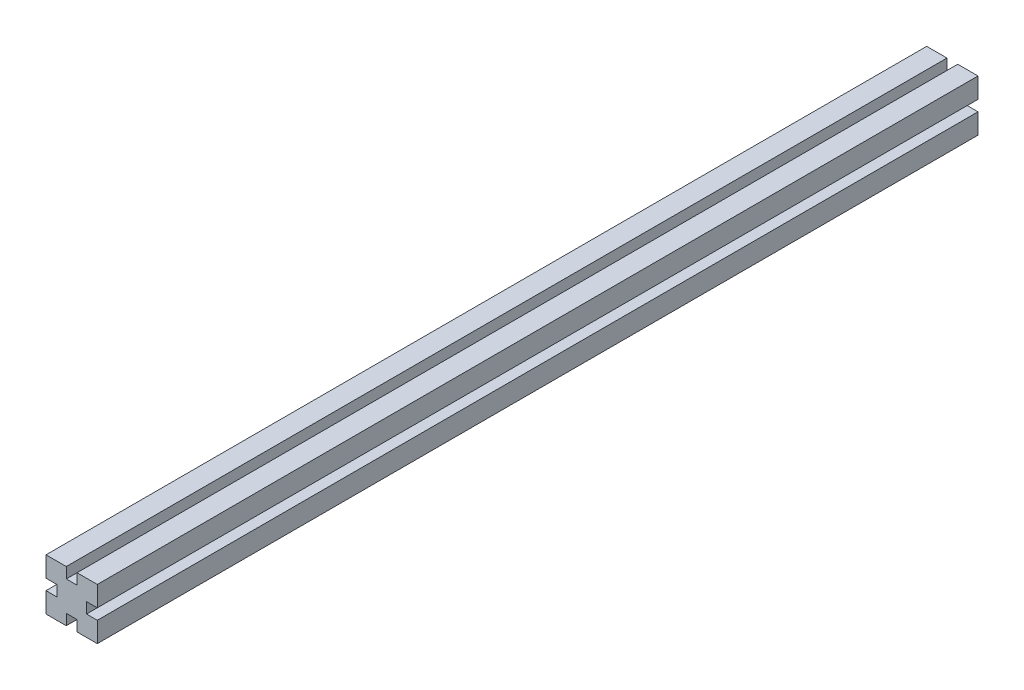
ISO-10303-21;
HEADER;
FILE_DESCRIPTION(('STEP AP214'),'2;1');
FILE_NAME('part.step','',(''),(''),'','','');
FILE_SCHEMA(('AUTOMOTIVE_DESIGN { 1 0 10303 214 1 1 1 1 }'));
ENDSEC;
DATA;
#1=APPLICATION_CONTEXT('core data for automotive mechanical design processes');
#2=APPLICATION_PROTOCOL_DEFINITION('international standard','automotive_design',2000,#1);
#3=PRODUCT_CONTEXT('',#1,'mechanical');
#4=PRODUCT('Part','Part','',(#3));
#5=PRODUCT_RELATED_PRODUCT_CATEGORY('part','',(#4));
#6=PRODUCT_DEFINITION_FORMATION('','',#4);
#7=PRODUCT_DEFINITION_CONTEXT('part definition',#1,'design');
#8=PRODUCT_DEFINITION('design','',#6,#7);
#9=PRODUCT_DEFINITION_SHAPE('','',#8);
#10=(LENGTH_UNIT() NAMED_UNIT(*) SI_UNIT(.MILLI.,.METRE.));
#11=(NAMED_UNIT(*) PLANE_ANGLE_UNIT() SI_UNIT($,.RADIAN.));
#12=(NAMED_UNIT(*) SI_UNIT($,.STERADIAN.) SOLID_ANGLE_UNIT());
#13=UNCERTAINTY_MEASURE_WITH_UNIT(LENGTH_MEASURE(1.E-05),#10,'distance_accuracy_value','');
#14=(GEOMETRIC_REPRESENTATION_CONTEXT(3) GLOBAL_UNCERTAINTY_ASSIGNED_CONTEXT((#13)) GLOBAL_UNIT_ASSIGNED_CONTEXT((#10,
#11,#12)) REPRESENTATION_CONTEXT('',''));
#15=CARTESIAN_POINT('',(0.,0.,0.));
#16=DIRECTION('',(0.,0.,1.));
#17=DIRECTION('',(1.,0.,0.));
#18=AXIS2_PLACEMENT_3D('',#15,#16,#17);
#19=CARTESIAN_POINT('',(-19.05,-4.,654.05));
#20=DIRECTION('',(1.,0.,0.));
#21=DIRECTION('',(0.,0.,-1.));
#22=AXIS2_PLACEMENT_3D('',#19,#20,#21);
#23=PLANE('',#22);
#24=DIRECTION('',(0.,-1.,0.));
#25=VECTOR('',#24,1.);
#26=CARTESIAN_POINT('',(-19.05,-4.,0.));
#27=LINE('',#26,#25);
#28=CARTESIAN_POINT('',(-19.05,-4.,0.));
#29=VERTEX_POINT('',#28);
#30=CARTESIAN_POINT('',(-19.05,-19.05,0.));
#31=VERTEX_POINT('',#30);
#32=EDGE_CURVE('E207',#29,#31,#27,.T.);
#33=ORIENTED_EDGE('',*,*,#32,.T.);
#34=DIRECTION('',(0.,0.,-1.));
#35=VECTOR('',#34,1.);
#36=CARTESIAN_POINT('',(-19.05,-19.05,654.05));
#37=LINE('',#36,#35);
#38=CARTESIAN_POINT('',(-19.05,-19.05,654.05));
#39=VERTEX_POINT('',#38);
#40=EDGE_CURVE('E11',#39,#31,#37,.T.);
#41=ORIENTED_EDGE('',*,*,#40,.F.);
#42=DIRECTION('',(0.,-1.,0.));
#43=VECTOR('',#42,1.);
#44=CARTESIAN_POINT('',(-19.05,-4.,654.05));
#45=LINE('',#44,#43);
#46=CARTESIAN_POINT('',(-19.05,-4.,654.05));
#47=VERTEX_POINT('',#46);
#48=EDGE_CURVE('E245',#47,#39,#45,.T.);
#49=ORIENTED_EDGE('',*,*,#48,.F.);
#50=DIRECTION('',(0.,0.,-1.));
#51=VECTOR('',#50,1.);
#52=CARTESIAN_POINT('',(-19.05,-4.,654.05));
#53=LINE('',#52,#51);
#54=EDGE_CURVE('E203',#47,#29,#53,.T.);
#55=ORIENTED_EDGE('',*,*,#54,.T.);
#56=EDGE_LOOP('',(#33,#41,#49,#55));
#57=FACE_BOUND('',#56,.T.);
#58=ADVANCED_FACE('F39',(#57),#23,.F.);
#59=CARTESIAN_POINT('',(-19.05,-19.05,654.05));
#60=DIRECTION('',(0.,1.,0.));
#61=DIRECTION('',(0.,0.,1.));
#62=AXIS2_PLACEMENT_3D('',#59,#60,#61);
#63=PLANE('',#62);
#64=DIRECTION('',(1.,0.,0.));
#65=VECTOR('',#64,1.);
#66=CARTESIAN_POINT('',(-19.05,-19.05,0.));
#67=LINE('',#66,#65);
#68=CARTESIAN_POINT('',(-4.,-19.05,0.));
#69=VERTEX_POINT('',#68);
#70=EDGE_CURVE('E210',#31,#69,#67,.T.);
#71=ORIENTED_EDGE('',*,*,#70,.T.);
#72=DIRECTION('',(0.,0.,-1.));
#73=VECTOR('',#72,1.);
#74=CARTESIAN_POINT('',(-4.,-19.05,654.05));
#75=LINE('',#74,#73);
#76=CARTESIAN_POINT('',(-4.,-19.05,654.05));
#77=VERTEX_POINT('',#76);
#78=EDGE_CURVE('E47',#77,#69,#75,.T.);
#79=ORIENTED_EDGE('',*,*,#78,.F.);
#80=DIRECTION('',(1.,0.,0.));
#81=VECTOR('',#80,1.);
#82=CARTESIAN_POINT('',(-19.05,-19.05,654.05));
#83=LINE('',#82,#81);
#84=EDGE_CURVE('E134',#39,#77,#83,.T.);
#85=ORIENTED_EDGE('',*,*,#84,.F.);
#86=ORIENTED_EDGE('',*,*,#40,.T.);
#87=EDGE_LOOP('',(#71,#79,#85,#86));
#88=FACE_BOUND('',#87,.T.);
#89=ADVANCED_FACE('F363',(#88),#63,.F.);
#90=CARTESIAN_POINT('',(-4.,-19.05,654.05));
#91=DIRECTION('',(-1.,0.,0.));
#92=DIRECTION('',(0.,0.,1.));
#93=AXIS2_PLACEMENT_3D('',#90,#91,#92);
#94=PLANE('',#93);
#95=DIRECTION('',(0.,1.,0.));
#96=VECTOR('',#95,1.);
#97=CARTESIAN_POINT('',(-4.,-19.05,0.));
#98=LINE('',#97,#96);
#99=CARTESIAN_POINT('',(-4.,-11.05,0.));
#100=VERTEX_POINT('',#99);
#101=EDGE_CURVE('E212',#69,#100,#98,.T.);
#102=ORIENTED_EDGE('',*,*,#101,.T.);
#103=DIRECTION('',(0.,0.,-1.));
#104=VECTOR('',#103,1.);
#105=CARTESIAN_POINT('',(-4.,-11.05,654.05));
#106=LINE('',#105,#104);
#107=CARTESIAN_POINT('',(-4.,-11.05,654.05));
#108=VERTEX_POINT('',#107);
#109=EDGE_CURVE('E288',#108,#100,#106,.T.);
#110=ORIENTED_EDGE('',*,*,#109,.F.);
#111=DIRECTION('',(0.,1.,0.));
#112=VECTOR('',#111,1.);
#113=CARTESIAN_POINT('',(-4.,-19.05,654.05));
#114=LINE('',#113,#112);
#115=EDGE_CURVE('E296',#77,#108,#114,.T.);
#116=ORIENTED_EDGE('',*,*,#115,.F.);
#117=ORIENTED_EDGE('',*,*,#78,.T.);
#118=EDGE_LOOP('',(#102,#110,#116,#117));
#119=FACE_BOUND('',#118,.T.);
#120=ADVANCED_FACE('F294',(#119),#94,.F.);
#121=CARTESIAN_POINT('',(-4.,-11.05,654.05));
#122=DIRECTION('',(0.,1.,0.));
#123=DIRECTION('',(0.,0.,1.));
#124=AXIS2_PLACEMENT_3D('',#121,#122,#123);
#125=PLANE('',#124);
#126=DIRECTION('',(1.,0.,0.));
#127=VECTOR('',#126,1.);
#128=CARTESIAN_POINT('',(-4.,-11.05,0.));
#129=LINE('',#128,#127);
#130=CARTESIAN_POINT('',(4.,-11.05,0.));
#131=VERTEX_POINT('',#130);
#132=EDGE_CURVE('E214',#100,#131,#129,.T.);
#133=ORIENTED_EDGE('',*,*,#132,.T.);
#134=DIRECTION('',(0.,0.,-1.));
#135=VECTOR('',#134,1.);
#136=CARTESIAN_POINT('',(4.,-11.05,654.05));
#137=LINE('',#136,#135);
#138=CARTESIAN_POINT('',(4.,-11.05,654.05));
#139=VERTEX_POINT('',#138);
#140=EDGE_CURVE('E285',#139,#131,#137,.T.);
#141=ORIENTED_EDGE('',*,*,#140,.F.);
#142=DIRECTION('',(1.,0.,0.));
#143=VECTOR('',#142,1.);
#144=CARTESIAN_POINT('',(-4.,-11.05,654.05));
#145=LINE('',#144,#143);
#146=EDGE_CURVE('E314',#108,#139,#145,.T.);
#147=ORIENTED_EDGE('',*,*,#146,.F.);
#148=ORIENTED_EDGE('',*,*,#109,.T.);
#149=EDGE_LOOP('',(#133,#141,#147,#148));
#150=FACE_BOUND('',#149,.T.);
#151=ADVANCED_FACE('F305',(#150),#125,.F.);
#152=CARTESIAN_POINT('',(4.,-11.05,654.05));
#153=DIRECTION('',(1.,0.,0.));
#154=DIRECTION('',(0.,0.,-1.));
#155=AXIS2_PLACEMENT_3D('',#152,#153,#154);
#156=PLANE('',#155);
#157=DIRECTION('',(0.,-1.,0.));
#158=VECTOR('',#157,1.);
#159=CARTESIAN_POINT('',(4.,-11.05,0.));
#160=LINE('',#159,#158);
#161=CARTESIAN_POINT('',(4.,-19.05,0.));
#162=VERTEX_POINT('',#161);
#163=EDGE_CURVE('E216',#131,#162,#160,.T.);
#164=ORIENTED_EDGE('',*,*,#163,.T.);
#165=DIRECTION('',(0.,0.,-1.));
#166=VECTOR('',#165,1.);
#167=CARTESIAN_POINT('',(4.,-19.05,654.05));
#168=LINE('',#167,#166);
#169=CARTESIAN_POINT('',(4.,-19.05,654.05));
#170=VERTEX_POINT('',#169);
#171=EDGE_CURVE('E282',#170,#162,#168,.T.);
#172=ORIENTED_EDGE('',*,*,#171,.F.);
#173=DIRECTION('',(0.,-1.,0.));
#174=VECTOR('',#173,1.);
#175=CARTESIAN_POINT('',(4.,-11.05,654.05));
#176=LINE('',#175,#174);
#177=EDGE_CURVE('E311',#139,#170,#176,.T.);
#178=ORIENTED_EDGE('',*,*,#177,.F.);
#179=ORIENTED_EDGE('',*,*,#140,.T.);
#180=EDGE_LOOP('',(#164,#172,#178,#179));
#181=FACE_BOUND('',#180,.T.);
#182=ADVANCED_FACE('F309',(#181),#156,.F.);
#183=CARTESIAN_POINT('',(4.,-19.05,654.05));
#184=DIRECTION('',(0.,1.,0.));
#185=DIRECTION('',(0.,0.,1.));
#186=AXIS2_PLACEMENT_3D('',#183,#184,#185);
#187=PLANE('',#186);
#188=DIRECTION('',(1.,0.,0.));
#189=VECTOR('',#188,1.);
#190=CARTESIAN_POINT('',(4.,-19.05,0.));
#191=LINE('',#190,#189);
#192=CARTESIAN_POINT('',(19.05,-19.05,0.));
#193=VERTEX_POINT('',#192);
#194=EDGE_CURVE('E218',#162,#193,#191,.T.);
#195=ORIENTED_EDGE('',*,*,#194,.T.);
#196=DIRECTION('',(0.,0.,-1.));
#197=VECTOR('',#196,1.);
#198=CARTESIAN_POINT('',(19.05,-19.05,654.05));
#199=LINE('',#198,#197);
#200=CARTESIAN_POINT('',(19.05,-19.05,654.05));
#201=VERTEX_POINT('',#200);
#202=EDGE_CURVE('E279',#201,#193,#199,.T.);
#203=ORIENTED_EDGE('',*,*,#202,.F.);
#204=DIRECTION('',(1.,0.,0.));
#205=VECTOR('',#204,1.);
#206=CARTESIAN_POINT('',(4.,-19.05,654.05));
#207=LINE('',#206,#205);
#208=EDGE_CURVE('E313',#170,#201,#207,.T.);
#209=ORIENTED_EDGE('',*,*,#208,.F.);
#210=ORIENTED_EDGE('',*,*,#171,.T.);
#211=EDGE_LOOP('',(#195,#203,#209,#210));
#212=FACE_BOUND('',#211,.T.);
#213=ADVANCED_FACE('F376',(#212),#187,.F.);
#214=CARTESIAN_POINT('',(19.05,-19.05,654.05));
#215=DIRECTION('',(-1.,0.,0.));
#216=DIRECTION('',(0.,0.,1.));
#217=AXIS2_PLACEMENT_3D('',#214,#215,#216);
#218=PLANE('',#217);
#219=DIRECTION('',(0.,1.,0.));
#220=VECTOR('',#219,1.);
#221=CARTESIAN_POINT('',(19.05,-19.05,0.));
#222=LINE('',#221,#220);
#223=CARTESIAN_POINT('',(19.05,-4.,0.));
#224=VERTEX_POINT('',#223);
#225=EDGE_CURVE('E220',#193,#224,#222,.T.);
#226=ORIENTED_EDGE('',*,*,#225,.T.);
#227=DIRECTION('',(0.,0.,-1.));
#228=VECTOR('',#227,1.);
#229=CARTESIAN_POINT('',(19.05,-4.,654.05));
#230=LINE('',#229,#228);
#231=CARTESIAN_POINT('',(19.05,-4.,654.05));
#232=VERTEX_POINT('',#231);
#233=EDGE_CURVE('E276',#232,#224,#230,.T.);
#234=ORIENTED_EDGE('',*,*,#233,.F.);
#235=DIRECTION('',(0.,1.,0.));
#236=VECTOR('',#235,1.);
#237=CARTESIAN_POINT('',(19.05,-19.05,654.05));
#238=LINE('',#237,#236);
#239=EDGE_CURVE('E316',#201,#232,#238,.T.);
#240=ORIENTED_EDGE('',*,*,#239,.F.);
#241=ORIENTED_EDGE('',*,*,#202,.T.);
#242=EDGE_LOOP('',(#226,#234,#240,#241));
#243=FACE_BOUND('',#242,.T.);
#244=ADVANCED_FACE('F379',(#243),#218,.F.);
#245=CARTESIAN_POINT('',(19.05,-4.,654.05));
#246=DIRECTION('',(0.,-1.,0.));
#247=DIRECTION('',(0.,0.,-1.));
#248=AXIS2_PLACEMENT_3D('',#245,#246,#247);
#249=PLANE('',#248);
#250=DIRECTION('',(-1.,0.,0.));
#251=VECTOR('',#250,1.);
#252=CARTESIAN_POINT('',(19.05,-4.,0.));
#253=LINE('',#252,#251);
#254=CARTESIAN_POINT('',(11.05,-4.,0.));
#255=VERTEX_POINT('',#254);
#256=EDGE_CURVE('E222',#224,#255,#253,.T.);
#257=ORIENTED_EDGE('',*,*,#256,.T.);
#258=DIRECTION('',(0.,0.,-1.));
#259=VECTOR('',#258,1.);
#260=CARTESIAN_POINT('',(11.05,-4.,654.05));
#261=LINE('',#260,#259);
#262=CARTESIAN_POINT('',(11.05,-4.,654.05));
#263=VERTEX_POINT('',#262);
#264=EDGE_CURVE('E273',#263,#255,#261,.T.);
#265=ORIENTED_EDGE('',*,*,#264,.F.);
#266=DIRECTION('',(-1.,0.,0.));
#267=VECTOR('',#266,1.);
#268=CARTESIAN_POINT('',(19.05,-4.,654.05));
#269=LINE('',#268,#267);
#270=EDGE_CURVE('E322',#232,#263,#269,.T.);
#271=ORIENTED_EDGE('',*,*,#270,.F.);
#272=ORIENTED_EDGE('',*,*,#233,.T.);
#273=EDGE_LOOP('',(#257,#265,#271,#272));
#274=FACE_BOUND('',#273,.T.);
#275=ADVANCED_FACE('F383',(#274),#249,.F.);
#276=CARTESIAN_POINT('',(11.05,-4.,654.05));
#277=DIRECTION('',(-1.,0.,0.));
#278=DIRECTION('',(0.,0.,1.));
#279=AXIS2_PLACEMENT_3D('',#276,#277,#278);
#280=PLANE('',#279);
#281=DIRECTION('',(0.,1.,0.));
#282=VECTOR('',#281,1.);
#283=CARTESIAN_POINT('',(11.05,-4.,0.));
#284=LINE('',#283,#282);
#285=CARTESIAN_POINT('',(11.05,4.,0.));
#286=VERTEX_POINT('',#285);
#287=EDGE_CURVE('E224',#255,#286,#284,.T.);
#288=ORIENTED_EDGE('',*,*,#287,.T.);
#289=DIRECTION('',(0.,0.,-1.));
#290=VECTOR('',#289,1.);
#291=CARTESIAN_POINT('',(11.05,4.,654.05));
#292=LINE('',#291,#290);
#293=CARTESIAN_POINT('',(11.05,4.,654.05));
#294=VERTEX_POINT('',#293);
#295=EDGE_CURVE('E270',#294,#286,#292,.T.);
#296=ORIENTED_EDGE('',*,*,#295,.F.);
#297=DIRECTION('',(0.,1.,0.));
#298=VECTOR('',#297,1.);
#299=CARTESIAN_POINT('',(11.05,-4.,654.05));
#300=LINE('',#299,#298);
#301=EDGE_CURVE('E324',#263,#294,#300,.T.);
#302=ORIENTED_EDGE('',*,*,#301,.F.);
#303=ORIENTED_EDGE('',*,*,#264,.T.);
#304=EDGE_LOOP('',(#288,#296,#302,#303));
#305=FACE_BOUND('',#304,.T.);
#306=ADVANCED_FACE('F387',(#305),#280,.F.);
#307=CARTESIAN_POINT('',(11.05,4.,654.05));
#308=DIRECTION('',(0.,1.,0.));
#309=DIRECTION('',(0.,0.,1.));
#310=AXIS2_PLACEMENT_3D('',#307,#308,#309);
#311=PLANE('',#310);
#312=DIRECTION('',(1.,0.,0.));
#313=VECTOR('',#312,1.);
#314=CARTESIAN_POINT('',(11.05,4.,0.));
#315=LINE('',#314,#313);
#316=CARTESIAN_POINT('',(19.05,4.,0.));
#317=VERTEX_POINT('',#316);
#318=EDGE_CURVE('E226',#286,#317,#315,.T.);
#319=ORIENTED_EDGE('',*,*,#318,.T.);
#320=DIRECTION('',(0.,0.,-1.));
#321=VECTOR('',#320,1.);
#322=CARTESIAN_POINT('',(19.05,4.,654.05));
#323=LINE('',#322,#321);
#324=CARTESIAN_POINT('',(19.05,4.,654.05));
#325=VERTEX_POINT('',#324);
#326=EDGE_CURVE('E267',#325,#317,#323,.T.);
#327=ORIENTED_EDGE('',*,*,#326,.F.);
#328=DIRECTION('',(1.,0.,0.));
#329=VECTOR('',#328,1.);
#330=CARTESIAN_POINT('',(11.05,4.,654.05));
#331=LINE('',#330,#329);
#332=EDGE_CURVE('E326',#294,#325,#331,.T.);
#333=ORIENTED_EDGE('',*,*,#332,.F.);
#334=ORIENTED_EDGE('',*,*,#295,.T.);
#335=EDGE_LOOP('',(#319,#327,#333,#334));
#336=FACE_BOUND('',#335,.T.);
#337=ADVANCED_FACE('F391',(#336),#311,.F.);
#338=CARTESIAN_POINT('',(19.05,4.,654.05));
#339=DIRECTION('',(-1.,0.,0.));
#340=DIRECTION('',(0.,0.,1.));
#341=AXIS2_PLACEMENT_3D('',#338,#339,#340);
#342=PLANE('',#341);
#343=DIRECTION('',(0.,1.,0.));
#344=VECTOR('',#343,1.);
#345=CARTESIAN_POINT('',(19.05,4.,0.));
#346=LINE('',#345,#344);
#347=CARTESIAN_POINT('',(19.05,19.05,0.));
#348=VERTEX_POINT('',#347);
#349=EDGE_CURVE('E228',#317,#348,#346,.T.);
#350=ORIENTED_EDGE('',*,*,#349,.T.);
#351=DIRECTION('',(0.,0.,-1.));
#352=VECTOR('',#351,1.);
#353=CARTESIAN_POINT('',(19.05,19.05,654.05));
#354=LINE('',#353,#352);
#355=CARTESIAN_POINT('',(19.05,19.05,654.05));
#356=VERTEX_POINT('',#355);
#357=EDGE_CURVE('E264',#356,#348,#354,.T.);
#358=ORIENTED_EDGE('',*,*,#357,.F.);
#359=DIRECTION('',(0.,1.,0.));
#360=VECTOR('',#359,1.);
#361=CARTESIAN_POINT('',(19.05,4.,654.05));
#362=LINE('',#361,#360);
#363=EDGE_CURVE('E328',#325,#356,#362,.T.);
#364=ORIENTED_EDGE('',*,*,#363,.F.);
#365=ORIENTED_EDGE('',*,*,#326,.T.);
#366=EDGE_LOOP('',(#350,#358,#364,#365));
#367=FACE_BOUND('',#366,.T.);
#368=ADVANCED_FACE('F395',(#367),#342,.F.);
#369=CARTESIAN_POINT('',(19.05,19.05,654.05));
#370=DIRECTION('',(0.,-1.,0.));
#371=DIRECTION('',(0.,0.,-1.));
#372=AXIS2_PLACEMENT_3D('',#369,#370,#371);
#373=PLANE('',#372);
#374=DIRECTION('',(-1.,0.,0.));
#375=VECTOR('',#374,1.);
#376=CARTESIAN_POINT('',(19.05,19.05,0.));
#377=LINE('',#376,#375);
#378=CARTESIAN_POINT('',(4.,19.05,0.));
#379=VERTEX_POINT('',#378);
#380=EDGE_CURVE('E230',#348,#379,#377,.T.);
#381=ORIENTED_EDGE('',*,*,#380,.T.);
#382=DIRECTION('',(0.,0.,-1.));
#383=VECTOR('',#382,1.);
#384=CARTESIAN_POINT('',(4.,19.05,654.05));
#385=LINE('',#384,#383);
#386=CARTESIAN_POINT('',(4.,19.05,654.05));
#387=VERTEX_POINT('',#386);
#388=EDGE_CURVE('E261',#387,#379,#385,.T.);
#389=ORIENTED_EDGE('',*,*,#388,.F.);
#390=DIRECTION('',(-1.,0.,0.));
#391=VECTOR('',#390,1.);
#392=CARTESIAN_POINT('',(19.05,19.05,654.05));
#393=LINE('',#392,#391);
#394=EDGE_CURVE('E330',#356,#387,#393,.T.);
#395=ORIENTED_EDGE('',*,*,#394,.F.);
#396=ORIENTED_EDGE('',*,*,#357,.T.);
#397=EDGE_LOOP('',(#381,#389,#395,#396));
#398=FACE_BOUND('',#397,.T.);
#399=ADVANCED_FACE('F399',(#398),#373,.F.);
#400=CARTESIAN_POINT('',(4.,19.05,654.05));
#401=DIRECTION('',(1.,0.,0.));
#402=DIRECTION('',(0.,0.,-1.));
#403=AXIS2_PLACEMENT_3D('',#400,#401,#402);
#404=PLANE('',#403);
#405=DIRECTION('',(0.,-1.,0.));
#406=VECTOR('',#405,1.);
#407=CARTESIAN_POINT('',(4.,19.05,0.));
#408=LINE('',#407,#406);
#409=CARTESIAN_POINT('',(4.,11.05,0.));
#410=VERTEX_POINT('',#409);
#411=EDGE_CURVE('E232',#379,#410,#408,.T.);
#412=ORIENTED_EDGE('',*,*,#411,.T.);
#413=DIRECTION('',(0.,0.,-1.));
#414=VECTOR('',#413,1.);
#415=CARTESIAN_POINT('',(4.,11.05,654.05));
#416=LINE('',#415,#414);
#417=CARTESIAN_POINT('',(4.,11.05,654.05));
#418=VERTEX_POINT('',#417);
#419=EDGE_CURVE('E258',#418,#410,#416,.T.);
#420=ORIENTED_EDGE('',*,*,#419,.F.);
#421=DIRECTION('',(0.,-1.,0.));
#422=VECTOR('',#421,1.);
#423=CARTESIAN_POINT('',(4.,19.05,654.05));
#424=LINE('',#423,#422);
#425=EDGE_CURVE('E332',#387,#418,#424,.T.);
#426=ORIENTED_EDGE('',*,*,#425,.F.);
#427=ORIENTED_EDGE('',*,*,#388,.T.);
#428=EDGE_LOOP('',(#412,#420,#426,#427));
#429=FACE_BOUND('',#428,.T.);
#430=ADVANCED_FACE('F403',(#429),#404,.F.);
#431=CARTESIAN_POINT('',(4.,11.05,654.05));
#432=DIRECTION('',(0.,-1.,0.));
#433=DIRECTION('',(0.,0.,-1.));
#434=AXIS2_PLACEMENT_3D('',#431,#432,#433);
#435=PLANE('',#434);
#436=DIRECTION('',(-1.,0.,0.));
#437=VECTOR('',#436,1.);
#438=CARTESIAN_POINT('',(4.,11.05,0.));
#439=LINE('',#438,#437);
#440=CARTESIAN_POINT('',(-4.,11.05,0.));
#441=VERTEX_POINT('',#440);
#442=EDGE_CURVE('E234',#410,#441,#439,.T.);
#443=ORIENTED_EDGE('',*,*,#442,.T.);
#444=DIRECTION('',(0.,0.,-1.));
#445=VECTOR('',#444,1.);
#446=CARTESIAN_POINT('',(-4.,11.05,654.05));
#447=LINE('',#446,#445);
#448=CARTESIAN_POINT('',(-4.,11.05,654.05));
#449=VERTEX_POINT('',#448);
#450=EDGE_CURVE('E255',#449,#441,#447,.T.);
#451=ORIENTED_EDGE('',*,*,#450,.F.);
#452=DIRECTION('',(-1.,0.,0.));
#453=VECTOR('',#452,1.);
#454=CARTESIAN_POINT('',(4.,11.05,654.05));
#455=LINE('',#454,#453);
#456=EDGE_CURVE('E334',#418,#449,#455,.T.);
#457=ORIENTED_EDGE('',*,*,#456,.F.);
#458=ORIENTED_EDGE('',*,*,#419,.T.);
#459=EDGE_LOOP('',(#443,#451,#457,#458));
#460=FACE_BOUND('',#459,.T.);
#461=ADVANCED_FACE('F407',(#460),#435,.F.);
#462=CARTESIAN_POINT('',(-4.,11.05,654.05));
#463=DIRECTION('',(-1.,0.,0.));
#464=DIRECTION('',(0.,0.,1.));
#465=AXIS2_PLACEMENT_3D('',#462,#463,#464);
#466=PLANE('',#465);
#467=DIRECTION('',(0.,1.,0.));
#468=VECTOR('',#467,1.);
#469=CARTESIAN_POINT('',(-4.,11.05,0.));
#470=LINE('',#469,#468);
#471=CARTESIAN_POINT('',(-4.,19.05,0.));
#472=VERTEX_POINT('',#471);
#473=EDGE_CURVE('E236',#441,#472,#470,.T.);
#474=ORIENTED_EDGE('',*,*,#473,.T.);
#475=DIRECTION('',(0.,0.,-1.));
#476=VECTOR('',#475,1.);
#477=CARTESIAN_POINT('',(-4.,19.05,654.05));
#478=LINE('',#477,#476);
#479=CARTESIAN_POINT('',(-4.,19.05,654.05));
#480=VERTEX_POINT('',#479);
#481=EDGE_CURVE('E252',#480,#472,#478,.T.);
#482=ORIENTED_EDGE('',*,*,#481,.F.);
#483=DIRECTION('',(0.,1.,0.));
#484=VECTOR('',#483,1.);
#485=CARTESIAN_POINT('',(-4.,11.05,654.05));
#486=LINE('',#485,#484);
#487=EDGE_CURVE('E336',#449,#480,#486,.T.);
#488=ORIENTED_EDGE('',*,*,#487,.F.);
#489=ORIENTED_EDGE('',*,*,#450,.T.);
#490=EDGE_LOOP('',(#474,#482,#488,#489));
#491=FACE_BOUND('',#490,.T.);
#492=ADVANCED_FACE('F411',(#491),#466,.F.);
#493=CARTESIAN_POINT('',(-4.,19.05,654.05));
#494=DIRECTION('',(0.,-1.,0.));
#495=DIRECTION('',(0.,0.,-1.));
#496=AXIS2_PLACEMENT_3D('',#493,#494,#495);
#497=PLANE('',#496);
#498=DIRECTION('',(-1.,0.,0.));
#499=VECTOR('',#498,1.);
#500=CARTESIAN_POINT('',(-4.,19.05,0.));
#501=LINE('',#500,#499);
#502=CARTESIAN_POINT('',(-19.05,19.05,0.));
#503=VERTEX_POINT('',#502);
#504=EDGE_CURVE('E238',#472,#503,#501,.T.);
#505=ORIENTED_EDGE('',*,*,#504,.T.);
#506=DIRECTION('',(0.,0.,-1.));
#507=VECTOR('',#506,1.);
#508=CARTESIAN_POINT('',(-19.05,19.05,654.05));
#509=LINE('',#508,#507);
#510=CARTESIAN_POINT('',(-19.05,19.05,654.05));
#511=VERTEX_POINT('',#510);
#512=EDGE_CURVE('E249',#511,#503,#509,.T.);
#513=ORIENTED_EDGE('',*,*,#512,.F.);
#514=DIRECTION('',(-1.,0.,0.));
#515=VECTOR('',#514,1.);
#516=CARTESIAN_POINT('',(-4.,19.05,654.05));
#517=LINE('',#516,#515);
#518=EDGE_CURVE('E338',#480,#511,#517,.T.);
#519=ORIENTED_EDGE('',*,*,#518,.F.);
#520=ORIENTED_EDGE('',*,*,#481,.T.);
#521=EDGE_LOOP('',(#505,#513,#519,#520));
#522=FACE_BOUND('',#521,.T.);
#523=ADVANCED_FACE('F344',(#522),#497,.F.);
#524=CARTESIAN_POINT('',(-19.05,19.05,654.05));
#525=DIRECTION('',(1.,0.,0.));
#526=DIRECTION('',(0.,0.,-1.));
#527=AXIS2_PLACEMENT_3D('',#524,#525,#526);
#528=PLANE('',#527);
#529=DIRECTION('',(0.,-1.,0.));
#530=VECTOR('',#529,1.);
#531=CARTESIAN_POINT('',(-19.05,19.05,0.));
#532=LINE('',#531,#530);
#533=CARTESIAN_POINT('',(-19.05,4.,0.));
#534=VERTEX_POINT('',#533);
#535=EDGE_CURVE('E240',#503,#534,#532,.T.);
#536=ORIENTED_EDGE('',*,*,#535,.T.);
#537=DIRECTION('',(0.,0.,-1.));
#538=VECTOR('',#537,1.);
#539=CARTESIAN_POINT('',(-19.05,4.,654.05));
#540=LINE('',#539,#538);
#541=CARTESIAN_POINT('',(-19.05,4.,654.05));
#542=VERTEX_POINT('',#541);
#543=EDGE_CURVE('E198',#542,#534,#540,.T.);
#544=ORIENTED_EDGE('',*,*,#543,.F.);
#545=DIRECTION('',(0.,-1.,0.));
#546=VECTOR('',#545,1.);
#547=CARTESIAN_POINT('',(-19.05,19.05,654.05));
#548=LINE('',#547,#546);
#549=EDGE_CURVE('E189',#511,#542,#548,.T.);
#550=ORIENTED_EDGE('',*,*,#549,.F.);
#551=ORIENTED_EDGE('',*,*,#512,.T.);
#552=EDGE_LOOP('',(#536,#544,#550,#551));
#553=FACE_BOUND('',#552,.T.);
#554=ADVANCED_FACE('F348',(#553),#528,.F.);
#555=CARTESIAN_POINT('',(-19.05,4.,654.05));
#556=DIRECTION('',(0.,1.,0.));
#557=DIRECTION('',(0.,0.,1.));
#558=AXIS2_PLACEMENT_3D('',#555,#556,#557);
#559=PLANE('',#558);
#560=DIRECTION('',(1.,0.,0.));
#561=VECTOR('',#560,1.);
#562=CARTESIAN_POINT('',(-19.05,4.,0.));
#563=LINE('',#562,#561);
#564=CARTESIAN_POINT('',(-11.05,4.,0.));
#565=VERTEX_POINT('',#564);
#566=EDGE_CURVE('E197',#534,#565,#563,.T.);
#567=ORIENTED_EDGE('',*,*,#566,.T.);
#568=DIRECTION('',(0.,0.,-1.));
#569=VECTOR('',#568,1.);
#570=CARTESIAN_POINT('',(-11.05,4.,654.05));
#571=LINE('',#570,#569);
#572=CARTESIAN_POINT('',(-11.05,4.,654.05));
#573=VERTEX_POINT('',#572);
#574=EDGE_CURVE('E194',#573,#565,#571,.T.);
#575=ORIENTED_EDGE('',*,*,#574,.F.);
#576=DIRECTION('',(1.,0.,0.));
#577=VECTOR('',#576,1.);
#578=CARTESIAN_POINT('',(-19.05,4.,654.05));
#579=LINE('',#578,#577);
#580=EDGE_CURVE('E183',#542,#573,#579,.T.);
#581=ORIENTED_EDGE('',*,*,#580,.F.);
#582=ORIENTED_EDGE('',*,*,#543,.T.);
#583=EDGE_LOOP('',(#567,#575,#581,#582));
#584=FACE_BOUND('',#583,.T.);
#585=ADVANCED_FACE('F195',(#584),#559,.F.);
#586=CARTESIAN_POINT('',(-11.05,4.,654.05));
#587=DIRECTION('',(1.,0.,0.));
#588=DIRECTION('',(0.,0.,-1.));
#589=AXIS2_PLACEMENT_3D('',#586,#587,#588);
#590=PLANE('',#589);
#591=DIRECTION('',(0.,-1.,0.));
#592=VECTOR('',#591,1.);
#593=CARTESIAN_POINT('',(-11.05,4.,0.));
#594=LINE('',#593,#592);
#595=CARTESIAN_POINT('',(-11.05,-4.,0.));
#596=VERTEX_POINT('',#595);
#597=EDGE_CURVE('E120',#565,#596,#594,.T.);
#598=ORIENTED_EDGE('',*,*,#597,.T.);
#599=DIRECTION('',(0.,0.,-1.));
#600=VECTOR('',#599,1.);
#601=CARTESIAN_POINT('',(-11.05,-4.,654.05));
#602=LINE('',#601,#600);
#603=CARTESIAN_POINT('',(-11.05,-4.,654.05));
#604=VERTEX_POINT('',#603);
#605=EDGE_CURVE('E199',#604,#596,#602,.T.);
#606=ORIENTED_EDGE('',*,*,#605,.F.);
#607=DIRECTION('',(0.,-1.,0.));
#608=VECTOR('',#607,1.);
#609=CARTESIAN_POINT('',(-11.05,4.,654.05));
#610=LINE('',#609,#608);
#611=EDGE_CURVE('E187',#573,#604,#610,.T.);
#612=ORIENTED_EDGE('',*,*,#611,.F.);
#613=ORIENTED_EDGE('',*,*,#574,.T.);
#614=EDGE_LOOP('',(#598,#606,#612,#613));
#615=FACE_BOUND('',#614,.T.);
#616=ADVANCED_FACE('F201',(#615),#590,.F.);
#617=CARTESIAN_POINT('',(-11.05,-4.,654.05));
#618=DIRECTION('',(0.,-1.,0.));
#619=DIRECTION('',(0.,0.,-1.));
#620=AXIS2_PLACEMENT_3D('',#617,#618,#619);
#621=PLANE('',#620);
#622=DIRECTION('',(-1.,0.,0.));
#623=VECTOR('',#622,1.);
#624=CARTESIAN_POINT('',(-11.05,-4.,0.));
#625=LINE('',#624,#623);
#626=EDGE_CURVE('E126',#596,#29,#625,.T.);
#627=ORIENTED_EDGE('',*,*,#626,.T.);
#628=ORIENTED_EDGE('',*,*,#54,.F.);
#629=DIRECTION('',(-1.,0.,0.));
#630=VECTOR('',#629,1.);
#631=CARTESIAN_POINT('',(-11.05,-4.,654.05));
#632=LINE('',#631,#630);
#633=EDGE_CURVE('E55',#604,#47,#632,.T.);
#634=ORIENTED_EDGE('',*,*,#633,.F.);
#635=ORIENTED_EDGE('',*,*,#605,.T.);
#636=EDGE_LOOP('',(#627,#628,#634,#635));
#637=FACE_BOUND('',#636,.T.);
#638=ADVANCED_FACE('F352',(#637),#621,.F.);
#639=CARTESIAN_POINT('',(0.,0.,654.05));
#640=DIRECTION('',(0.,0.,1.));
#641=DIRECTION('',(1.,0.,0.));
#642=AXIS2_PLACEMENT_3D('',#639,#640,#641);
#643=PLANE('',#642);
#644=ORIENTED_EDGE('',*,*,#48,.T.);
#645=ORIENTED_EDGE('',*,*,#84,.T.);
#646=ORIENTED_EDGE('',*,*,#115,.T.);
#647=ORIENTED_EDGE('',*,*,#146,.T.);
#648=ORIENTED_EDGE('',*,*,#177,.T.);
#649=ORIENTED_EDGE('',*,*,#208,.T.);
#650=ORIENTED_EDGE('',*,*,#239,.T.);
#651=ORIENTED_EDGE('',*,*,#270,.T.);
#652=ORIENTED_EDGE('',*,*,#301,.T.);
#653=ORIENTED_EDGE('',*,*,#332,.T.);
#654=ORIENTED_EDGE('',*,*,#363,.T.);
#655=ORIENTED_EDGE('',*,*,#394,.T.);
#656=ORIENTED_EDGE('',*,*,#425,.T.);
#657=ORIENTED_EDGE('',*,*,#456,.T.);
#658=ORIENTED_EDGE('',*,*,#487,.T.);
#659=ORIENTED_EDGE('',*,*,#518,.T.);
#660=ORIENTED_EDGE('',*,*,#549,.T.);
#661=ORIENTED_EDGE('',*,*,#580,.T.);
#662=ORIENTED_EDGE('',*,*,#611,.T.);
#663=ORIENTED_EDGE('',*,*,#633,.T.);
#664=EDGE_LOOP('',(#644,#645,#646,#647,#648,#649,#650,#651,#652,#653,#654,#655,#656,#657,#658,
#659,#660,#661,#662,#663));
#665=FACE_BOUND('',#664,.T.);
#666=ADVANCED_FACE('F185',(#665),#643,.T.);
#667=CARTESIAN_POINT('',(0.,0.,0.));
#668=DIRECTION('',(0.,0.,1.));
#669=DIRECTION('',(1.,0.,0.));
#670=AXIS2_PLACEMENT_3D('',#667,#668,#669);
#671=PLANE('',#670);
#672=ORIENTED_EDGE('',*,*,#32,.F.);
#673=ORIENTED_EDGE('',*,*,#626,.F.);
#674=ORIENTED_EDGE('',*,*,#597,.F.);
#675=ORIENTED_EDGE('',*,*,#566,.F.);
#676=ORIENTED_EDGE('',*,*,#535,.F.);
#677=ORIENTED_EDGE('',*,*,#504,.F.);
#678=ORIENTED_EDGE('',*,*,#473,.F.);
#679=ORIENTED_EDGE('',*,*,#442,.F.);
#680=ORIENTED_EDGE('',*,*,#411,.F.);
#681=ORIENTED_EDGE('',*,*,#380,.F.);
#682=ORIENTED_EDGE('',*,*,#349,.F.);
#683=ORIENTED_EDGE('',*,*,#318,.F.);
#684=ORIENTED_EDGE('',*,*,#287,.F.);
#685=ORIENTED_EDGE('',*,*,#256,.F.);
#686=ORIENTED_EDGE('',*,*,#225,.F.);
#687=ORIENTED_EDGE('',*,*,#194,.F.);
#688=ORIENTED_EDGE('',*,*,#163,.F.);
#689=ORIENTED_EDGE('',*,*,#132,.F.);
#690=ORIENTED_EDGE('',*,*,#101,.F.);
#691=ORIENTED_EDGE('',*,*,#70,.F.);
#692=EDGE_LOOP('',(#672,#673,#674,#675,#676,#677,#678,#679,#680,#681,#682,#683,#684,#685,#686,
#687,#688,#689,#690,#691));
#693=FACE_BOUND('',#692,.T.);
#694=ADVANCED_FACE('F300',(#693),#671,.F.);
#695=CLOSED_SHELL('',(#58,#89,#120,#151,#182,#213,#244,#275,#306,#337,#368,#399,#430,#461,#492,
#523,#554,#585,#616,#638,#666,#694));
#696=MANIFOLD_SOLID_BREP('B2',#695);
#697=ADVANCED_BREP_SHAPE_REPRESENTATION('',(#18,#696),#14);
#698=SHAPE_DEFINITION_REPRESENTATION(#9,#697);
ENDSEC;
END-ISO-10303-21;
